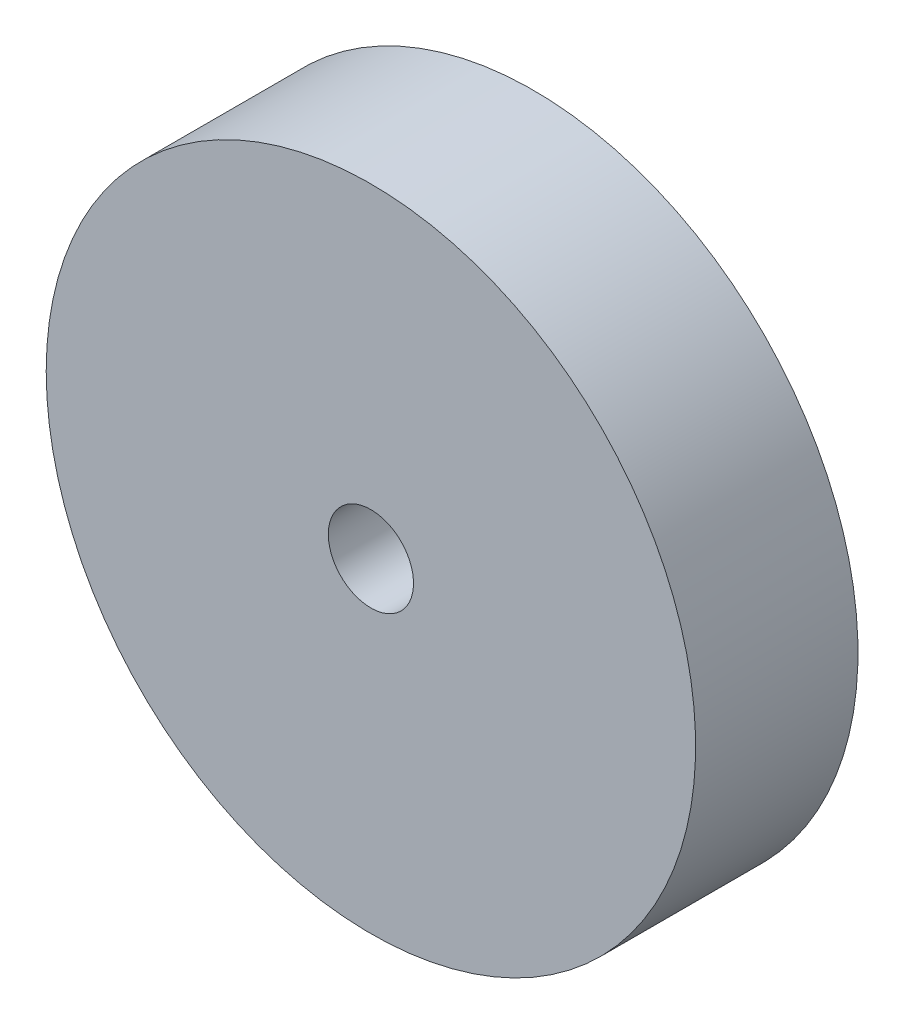
ISO-10303-21;
HEADER;
FILE_DESCRIPTION(('STEP AP214'),'2;1');
FILE_NAME('part.step','',(''),(''),'','','');
FILE_SCHEMA(('AUTOMOTIVE_DESIGN { 1 0 10303 214 1 1 1 1 }'));
ENDSEC;
DATA;
#1=APPLICATION_CONTEXT('core data for automotive mechanical design processes');
#2=APPLICATION_PROTOCOL_DEFINITION('international standard','automotive_design',2000,#1);
#3=PRODUCT_CONTEXT('',#1,'mechanical');
#4=PRODUCT('Part','Part','',(#3));
#5=PRODUCT_RELATED_PRODUCT_CATEGORY('part','',(#4));
#6=PRODUCT_DEFINITION_FORMATION('','',#4);
#7=PRODUCT_DEFINITION_CONTEXT('part definition',#1,'design');
#8=PRODUCT_DEFINITION('design','',#6,#7);
#9=PRODUCT_DEFINITION_SHAPE('','',#8);
#10=(LENGTH_UNIT() NAMED_UNIT(*) SI_UNIT(.MILLI.,.METRE.));
#11=(NAMED_UNIT(*) PLANE_ANGLE_UNIT() SI_UNIT($,.RADIAN.));
#12=(NAMED_UNIT(*) SI_UNIT($,.STERADIAN.) SOLID_ANGLE_UNIT());
#13=UNCERTAINTY_MEASURE_WITH_UNIT(LENGTH_MEASURE(1.E-05),#10,'distance_accuracy_value','');
#14=(GEOMETRIC_REPRESENTATION_CONTEXT(3) GLOBAL_UNCERTAINTY_ASSIGNED_CONTEXT((#13)) GLOBAL_UNIT_ASSIGNED_CONTEXT((#10,
#11,#12)) REPRESENTATION_CONTEXT('',''));
#15=CARTESIAN_POINT('',(0.,0.,0.));
#16=DIRECTION('',(0.,0.,1.));
#17=DIRECTION('',(1.,0.,0.));
#18=AXIS2_PLACEMENT_3D('',#15,#16,#17);
#19=CARTESIAN_POINT('',(0.,0.,19.05));
#20=DIRECTION('',(0.,0.,-1.));
#21=DIRECTION('',(-1.,0.,0.));
#22=AXIS2_PLACEMENT_3D('',#19,#20,#21);
#23=CYLINDRICAL_SURFACE('',#22,38.1);
#24=CARTESIAN_POINT('',(0.,0.,19.05));
#25=DIRECTION('',(0.,0.,1.));
#26=DIRECTION('',(1.,0.,0.));
#27=AXIS2_PLACEMENT_3D('',#24,#25,#26);
#28=CIRCLE('',#27,38.1);
#29=CARTESIAN_POINT('',(-38.1,0.,19.05));
#30=VERTEX_POINT('',#29);
#31=EDGE_CURVE('E10',#30,#30,#28,.T.);
#32=CARTESIAN_POINT('',(0.,0.,0.));
#33=DIRECTION('',(0.,0.,1.));
#34=DIRECTION('',(1.,0.,0.));
#35=AXIS2_PLACEMENT_3D('',#32,#33,#34);
#36=CIRCLE('',#35,38.1);
#37=CARTESIAN_POINT('',(-38.1,0.,0.));
#38=VERTEX_POINT('',#37);
#39=EDGE_CURVE('E46',#38,#38,#36,.T.);
#40=CARTESIAN_POINT('',(-38.1,0.,19.05));
#41=CARTESIAN_POINT('',(-38.1,0.,18.8515625));
#42=CARTESIAN_POINT('',(-38.1,0.,18.653125));
#43=CARTESIAN_POINT('',(-38.1,0.,18.25625));
#44=CARTESIAN_POINT('',(-38.1,0.,18.0578125));
#45=CARTESIAN_POINT('',(-38.1,0.,17.6609375));
#46=CARTESIAN_POINT('',(-38.1,0.,17.4625));
#47=CARTESIAN_POINT('',(-38.1,0.,17.065625));
#48=CARTESIAN_POINT('',(-38.1,0.,16.8671875));
#49=CARTESIAN_POINT('',(-38.1,0.,16.4703125));
#50=CARTESIAN_POINT('',(-38.1,0.,16.271875));
#51=CARTESIAN_POINT('',(-38.1,0.,15.875));
#52=CARTESIAN_POINT('',(-38.1,0.,15.6765625));
#53=CARTESIAN_POINT('',(-38.1,0.,15.2796875));
#54=CARTESIAN_POINT('',(-38.1,0.,15.08125));
#55=CARTESIAN_POINT('',(-38.1,0.,14.684375));
#56=CARTESIAN_POINT('',(-38.1,0.,14.4859375));
#57=CARTESIAN_POINT('',(-38.1,0.,14.0890625));
#58=CARTESIAN_POINT('',(-38.1,0.,13.890625));
#59=CARTESIAN_POINT('',(-38.1,0.,13.49375));
#60=CARTESIAN_POINT('',(-38.1,0.,13.2953125));
#61=CARTESIAN_POINT('',(-38.1,0.,12.8984375));
#62=CARTESIAN_POINT('',(-38.1,0.,12.7));
#63=CARTESIAN_POINT('',(-38.1,0.,12.303125));
#64=CARTESIAN_POINT('',(-38.1,0.,12.1046875));
#65=CARTESIAN_POINT('',(-38.1,0.,11.7078125));
#66=CARTESIAN_POINT('',(-38.1,0.,11.509375));
#67=CARTESIAN_POINT('',(-38.1,0.,11.1125));
#68=CARTESIAN_POINT('',(-38.1,0.,10.9140625));
#69=CARTESIAN_POINT('',(-38.1,0.,10.5171875));
#70=CARTESIAN_POINT('',(-38.1,0.,10.31875));
#71=CARTESIAN_POINT('',(-38.1,0.,9.921875));
#72=CARTESIAN_POINT('',(-38.1,0.,9.7234375));
#73=CARTESIAN_POINT('',(-38.1,0.,9.3265625));
#74=CARTESIAN_POINT('',(-38.1,0.,9.128125));
#75=CARTESIAN_POINT('',(-38.1,0.,8.73125));
#76=CARTESIAN_POINT('',(-38.1,0.,8.5328125));
#77=CARTESIAN_POINT('',(-38.1,0.,8.1359375));
#78=CARTESIAN_POINT('',(-38.1,0.,7.9375));
#79=CARTESIAN_POINT('',(-38.1,0.,7.540625));
#80=CARTESIAN_POINT('',(-38.1,0.,7.3421875));
#81=CARTESIAN_POINT('',(-38.1,0.,6.9453125));
#82=CARTESIAN_POINT('',(-38.1,0.,6.746875));
#83=CARTESIAN_POINT('',(-38.1,0.,6.35));
#84=CARTESIAN_POINT('',(-38.1,0.,6.1515625));
#85=CARTESIAN_POINT('',(-38.1,0.,5.7546875));
#86=CARTESIAN_POINT('',(-38.1,0.,5.55625));
#87=CARTESIAN_POINT('',(-38.1,0.,5.159375));
#88=CARTESIAN_POINT('',(-38.1,0.,4.9609375));
#89=CARTESIAN_POINT('',(-38.1,0.,4.5640625));
#90=CARTESIAN_POINT('',(-38.1,0.,4.365625));
#91=CARTESIAN_POINT('',(-38.1,0.,3.96875));
#92=CARTESIAN_POINT('',(-38.1,0.,3.7703125));
#93=CARTESIAN_POINT('',(-38.1,0.,3.3734375));
#94=CARTESIAN_POINT('',(-38.1,0.,3.175));
#95=CARTESIAN_POINT('',(-38.1,0.,2.778125));
#96=CARTESIAN_POINT('',(-38.1,0.,2.5796875));
#97=CARTESIAN_POINT('',(-38.1,0.,2.1828125));
#98=CARTESIAN_POINT('',(-38.1,0.,1.984375));
#99=CARTESIAN_POINT('',(-38.1,0.,1.5875));
#100=CARTESIAN_POINT('',(-38.1,0.,1.3890625));
#101=CARTESIAN_POINT('',(-38.1,0.,0.992187500000001));
#102=CARTESIAN_POINT('',(-38.1,0.,0.793750000000001));
#103=CARTESIAN_POINT('',(-38.1,0.,0.396875));
#104=CARTESIAN_POINT('',(-38.1,0.,0.1984375));
#105=CARTESIAN_POINT('',(-38.1,0.,0.));
#106=B_SPLINE_CURVE_WITH_KNOTS('',3,(#40,#41,#42,#43,#44,#45,#46,#47,#48,#49,#50,#51,#52,#53,
#54,#55,#56,#57,#58,#59,#60,#61,#62,#63,#64,#65,#66,#67,#68,#69,#70,#71,#72,#73,#74,#75,#76,#77,
#78,#79,#80,#81,#82,#83,#84,#85,#86,#87,#88,#89,#90,#91,#92,#93,#94,#95,#96,#97,#98,#99,#100,
#101,#102,#103,#104,#105),.UNSPECIFIED.,.F.,.F.,(4,2,2,2,2,2,2,2,2,2,2,2,2,2,2,2,2,2,2,2,2,2,2,
2,2,2,2,2,2,2,2,2,4),(0.,0.5953125,1.190625,1.7859375,2.38125,2.9765625,3.571875,4.1671875,
4.7625,5.3578125,5.953125,6.5484375,7.14375,7.7390625,8.334375,8.9296875,9.525,10.1203125,
10.715625,11.3109375,11.90625,12.5015625,13.096875,13.6921875,14.2875,14.8828125,15.478125,
16.0734375,16.66875,17.2640625,17.859375,18.4546875,19.05),.UNSPECIFIED.);
#107=EDGE_CURVE('BSEAM43',#30,#38,#106,.T.);
#108=ORIENTED_EDGE('',*,*,#31,.F.);
#109=ORIENTED_EDGE('',*,*,#39,.T.);
#110=ORIENTED_EDGE('',*,*,#107,.T.);
#111=ORIENTED_EDGE('',*,*,#107,.F.);
#112=EDGE_LOOP('',(#108,#110,#109,#111));
#113=FACE_BOUND('',#112,.T.);
#114=ADVANCED_FACE('F43',(#113),#23,.T.);
#115=CARTESIAN_POINT('',(0.,0.,19.05));
#116=DIRECTION('',(0.,0.,1.));
#117=DIRECTION('',(1.,0.,0.));
#118=AXIS2_PLACEMENT_3D('',#115,#116,#117);
#119=PLANE('',#118);
#120=CARTESIAN_POINT('',(0.,0.,19.05));
#121=DIRECTION('',(0.,0.,-1.));
#122=DIRECTION('',(-1.,0.,0.));
#123=AXIS2_PLACEMENT_3D('',#120,#121,#122);
#124=CIRCLE('',#123,5.);
#125=CARTESIAN_POINT('',(-5.,0.,19.05));
#126=VERTEX_POINT('',#125);
#127=EDGE_CURVE('E55',#126,#126,#124,.T.);
#128=ORIENTED_EDGE('',*,*,#127,.T.);
#129=EDGE_LOOP('',(#128));
#130=FACE_BOUND('',#129,.T.);
#131=ORIENTED_EDGE('',*,*,#31,.T.);
#132=EDGE_LOOP('',(#131));
#133=FACE_BOUND('',#132,.T.);
#134=ADVANCED_FACE('F65',(#130,#133),#119,.T.);
#135=CARTESIAN_POINT('',(0.,0.,0.));
#136=DIRECTION('',(0.,0.,1.));
#137=DIRECTION('',(1.,0.,0.));
#138=AXIS2_PLACEMENT_3D('',#135,#136,#137);
#139=PLANE('',#138);
#140=CARTESIAN_POINT('',(0.,0.,0.));
#141=DIRECTION('',(0.,0.,-1.));
#142=DIRECTION('',(-1.,0.,0.));
#143=AXIS2_PLACEMENT_3D('',#140,#141,#142);
#144=CIRCLE('',#143,5.);
#145=CARTESIAN_POINT('',(-5.,0.,0.));
#146=VERTEX_POINT('',#145);
#147=EDGE_CURVE('E57',#146,#146,#144,.T.);
#148=ORIENTED_EDGE('',*,*,#147,.F.);
#149=EDGE_LOOP('',(#148));
#150=FACE_BOUND('',#149,.T.);
#151=ORIENTED_EDGE('',*,*,#39,.F.);
#152=EDGE_LOOP('',(#151));
#153=FACE_BOUND('',#152,.T.);
#154=ADVANCED_FACE('F70',(#150,#153),#139,.F.);
#155=CARTESIAN_POINT('',(0.,0.,19.05));
#156=DIRECTION('',(0.,0.,-1.));
#157=DIRECTION('',(-1.,0.,0.));
#158=AXIS2_PLACEMENT_3D('',#155,#156,#157);
#159=CYLINDRICAL_SURFACE('',#158,5.);
#160=CARTESIAN_POINT('',(-5.,0.,19.05));
#161=CARTESIAN_POINT('',(-5.,0.,18.8515625));
#162=CARTESIAN_POINT('',(-5.,0.,18.653125));
#163=CARTESIAN_POINT('',(-5.,0.,18.25625));
#164=CARTESIAN_POINT('',(-5.,0.,18.0578125));
#165=CARTESIAN_POINT('',(-5.,0.,17.6609375));
#166=CARTESIAN_POINT('',(-5.,0.,17.4625));
#167=CARTESIAN_POINT('',(-5.,0.,17.065625));
#168=CARTESIAN_POINT('',(-5.,0.,16.8671875));
#169=CARTESIAN_POINT('',(-5.,0.,16.4703125));
#170=CARTESIAN_POINT('',(-5.,0.,16.271875));
#171=CARTESIAN_POINT('',(-5.,0.,15.875));
#172=CARTESIAN_POINT('',(-5.,0.,15.6765625));
#173=CARTESIAN_POINT('',(-5.,0.,15.2796875));
#174=CARTESIAN_POINT('',(-5.,0.,15.08125));
#175=CARTESIAN_POINT('',(-5.,0.,14.684375));
#176=CARTESIAN_POINT('',(-5.,0.,14.4859375));
#177=CARTESIAN_POINT('',(-5.,0.,14.0890625));
#178=CARTESIAN_POINT('',(-5.,0.,13.890625));
#179=CARTESIAN_POINT('',(-5.,0.,13.49375));
#180=CARTESIAN_POINT('',(-5.,0.,13.2953125));
#181=CARTESIAN_POINT('',(-5.,0.,12.8984375));
#182=CARTESIAN_POINT('',(-5.,0.,12.7));
#183=CARTESIAN_POINT('',(-5.,0.,12.303125));
#184=CARTESIAN_POINT('',(-5.,0.,12.1046875));
#185=CARTESIAN_POINT('',(-5.,0.,11.7078125));
#186=CARTESIAN_POINT('',(-5.,0.,11.509375));
#187=CARTESIAN_POINT('',(-5.,0.,11.1125));
#188=CARTESIAN_POINT('',(-5.,0.,10.9140625));
#189=CARTESIAN_POINT('',(-5.,0.,10.5171875));
#190=CARTESIAN_POINT('',(-5.,0.,10.31875));
#191=CARTESIAN_POINT('',(-5.,0.,9.921875));
#192=CARTESIAN_POINT('',(-5.,0.,9.7234375));
#193=CARTESIAN_POINT('',(-5.,0.,9.3265625));
#194=CARTESIAN_POINT('',(-5.,0.,9.128125));
#195=CARTESIAN_POINT('',(-5.,0.,8.73125));
#196=CARTESIAN_POINT('',(-5.,0.,8.5328125));
#197=CARTESIAN_POINT('',(-5.,0.,8.1359375));
#198=CARTESIAN_POINT('',(-5.,0.,7.9375));
#199=CARTESIAN_POINT('',(-5.,0.,7.540625));
#200=CARTESIAN_POINT('',(-5.,0.,7.3421875));
#201=CARTESIAN_POINT('',(-5.,0.,6.9453125));
#202=CARTESIAN_POINT('',(-5.,0.,6.746875));
#203=CARTESIAN_POINT('',(-5.,0.,6.35));
#204=CARTESIAN_POINT('',(-5.,0.,6.1515625));
#205=CARTESIAN_POINT('',(-5.,0.,5.7546875));
#206=CARTESIAN_POINT('',(-5.,0.,5.55625));
#207=CARTESIAN_POINT('',(-5.,0.,5.159375));
#208=CARTESIAN_POINT('',(-5.,0.,4.9609375));
#209=CARTESIAN_POINT('',(-5.,0.,4.5640625));
#210=CARTESIAN_POINT('',(-5.,0.,4.365625));
#211=CARTESIAN_POINT('',(-5.,0.,3.96875));
#212=CARTESIAN_POINT('',(-5.,0.,3.7703125));
#213=CARTESIAN_POINT('',(-5.,0.,3.3734375));
#214=CARTESIAN_POINT('',(-5.,0.,3.175));
#215=CARTESIAN_POINT('',(-5.,0.,2.778125));
#216=CARTESIAN_POINT('',(-5.,0.,2.5796875));
#217=CARTESIAN_POINT('',(-5.,0.,2.1828125));
#218=CARTESIAN_POINT('',(-5.,0.,1.984375));
#219=CARTESIAN_POINT('',(-5.,0.,1.5875));
#220=CARTESIAN_POINT('',(-5.,0.,1.3890625));
#221=CARTESIAN_POINT('',(-5.,0.,0.992187500000001));
#222=CARTESIAN_POINT('',(-5.,0.,0.793750000000001));
#223=CARTESIAN_POINT('',(-5.,0.,0.396875));
#224=CARTESIAN_POINT('',(-5.,0.,0.1984375));
#225=CARTESIAN_POINT('',(-5.,0.,0.));
#226=B_SPLINE_CURVE_WITH_KNOTS('',3,(#160,#161,#162,#163,#164,#165,#166,#167,#168,#169,#170,
#171,#172,#173,#174,#175,#176,#177,#178,#179,#180,#181,#182,#183,#184,#185,#186,#187,#188,#189,
#190,#191,#192,#193,#194,#195,#196,#197,#198,#199,#200,#201,#202,#203,#204,#205,#206,#207,#208,
#209,#210,#211,#212,#213,#214,#215,#216,#217,#218,#219,#220,#221,#222,#223,#224,#225),
.UNSPECIFIED.,.F.,.F.,(4,2,2,2,2,2,2,2,2,2,2,2,2,2,2,2,2,2,2,2,2,2,2,2,2,2,2,2,2,2,2,2,4),(0.,
0.595312499999997,1.190625,1.7859375,2.38125,2.9765625,3.571875,4.1671875,4.7625,5.3578125,
5.953125,6.5484375,7.14375,7.7390625,8.334375,8.9296875,9.525,10.1203125,10.715625,11.3109375,
11.90625,12.5015625,13.096875,13.6921875,14.2875,14.8828125,15.478125,16.0734375,16.66875,
17.2640625,17.859375,18.4546875,19.05),.UNSPECIFIED.);
#227=EDGE_CURVE('BSEAM67',#126,#146,#226,.T.);
#228=ORIENTED_EDGE('',*,*,#127,.F.);
#229=ORIENTED_EDGE('',*,*,#147,.T.);
#230=ORIENTED_EDGE('',*,*,#227,.T.);
#231=ORIENTED_EDGE('',*,*,#227,.F.);
#232=EDGE_LOOP('',(#228,#230,#229,#231));
#233=FACE_BOUND('',#232,.T.);
#234=ADVANCED_FACE('F67',(#233),#159,.F.);
#235=CLOSED_SHELL('',(#114,#134,#154,#234));
#236=MANIFOLD_SOLID_BREP('B2',#235);
#237=ADVANCED_BREP_SHAPE_REPRESENTATION('',(#18,#236),#14);
#238=SHAPE_DEFINITION_REPRESENTATION(#9,#237);
ENDSEC;
END-ISO-10303-21;
